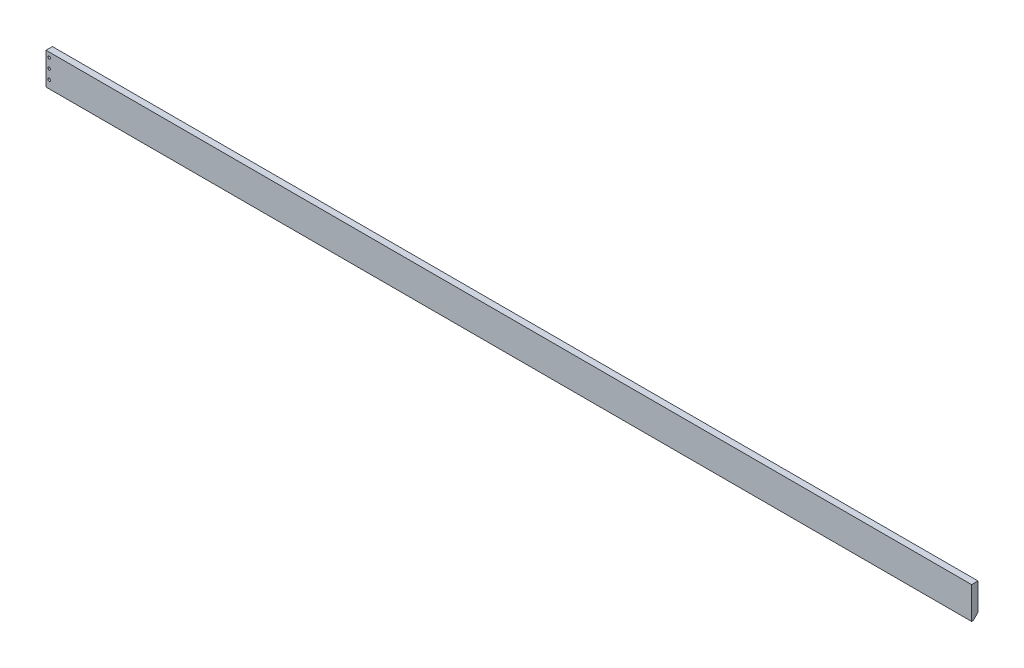
ISO-10303-21;
HEADER;
FILE_DESCRIPTION(('STEP AP214'),'2;1');
FILE_NAME('part.step','',(''),(''),'','','');
FILE_SCHEMA(('AUTOMOTIVE_DESIGN { 1 0 10303 214 1 1 1 1 }'));
ENDSEC;
DATA;
#1=APPLICATION_CONTEXT('core data for automotive mechanical design processes');
#2=APPLICATION_PROTOCOL_DEFINITION('international standard','automotive_design',2000,#1);
#3=PRODUCT_CONTEXT('',#1,'mechanical');
#4=PRODUCT('Part','Part','',(#3));
#5=PRODUCT_RELATED_PRODUCT_CATEGORY('part','',(#4));
#6=PRODUCT_DEFINITION_FORMATION('','',#4);
#7=PRODUCT_DEFINITION_CONTEXT('part definition',#1,'design');
#8=PRODUCT_DEFINITION('design','',#6,#7);
#9=PRODUCT_DEFINITION_SHAPE('','',#8);
#10=(LENGTH_UNIT() NAMED_UNIT(*) SI_UNIT(.MILLI.,.METRE.));
#11=(NAMED_UNIT(*) PLANE_ANGLE_UNIT() SI_UNIT($,.RADIAN.));
#12=(NAMED_UNIT(*) SI_UNIT($,.STERADIAN.) SOLID_ANGLE_UNIT());
#13=UNCERTAINTY_MEASURE_WITH_UNIT(LENGTH_MEASURE(1.E-05),#10,'distance_accuracy_value','');
#14=(GEOMETRIC_REPRESENTATION_CONTEXT(3) GLOBAL_UNCERTAINTY_ASSIGNED_CONTEXT((#13)) GLOBAL_UNIT_ASSIGNED_CONTEXT((#10,
#11,#12)) REPRESENTATION_CONTEXT('',''));
#15=CARTESIAN_POINT('',(0.,0.,0.));
#16=DIRECTION('',(0.,0.,1.));
#17=DIRECTION('',(1.,0.,0.));
#18=AXIS2_PLACEMENT_3D('',#15,#16,#17);
#19=CARTESIAN_POINT('',(1450.,50.,-20.));
#20=DIRECTION('',(-1.,0.,0.));
#21=DIRECTION('',(0.,0.,-1.));
#22=AXIS2_PLACEMENT_3D('',#19,#20,#21);
#23=PLANE('',#22);
#24=DIRECTION('',(0.,1.,0.));
#25=VECTOR('',#24,1.);
#26=CARTESIAN_POINT('',(1450.,50.,-20.));
#27=LINE('',#26,#25);
#28=CARTESIAN_POINT('',(1450.,-34.9999999999999,-20.));
#29=VERTEX_POINT('',#28);
#30=CARTESIAN_POINT('',(1450.,50.,-20.));
#31=VERTEX_POINT('',#30);
#32=EDGE_CURVE('E88',#29,#31,#27,.T.);
#33=ORIENTED_EDGE('',*,*,#32,.T.);
#34=DIRECTION('',(0.,0.,1.));
#35=VECTOR('',#34,1.);
#36=CARTESIAN_POINT('',(1450.,50.,-20.));
#37=LINE('',#36,#35);
#38=CARTESIAN_POINT('',(1450.,50.,0.));
#39=VERTEX_POINT('',#38);
#40=EDGE_CURVE('E96',#31,#39,#37,.T.);
#41=ORIENTED_EDGE('',*,*,#40,.T.);
#42=DIRECTION('',(0.,1.,0.));
#43=VECTOR('',#42,1.);
#44=CARTESIAN_POINT('',(1450.,50.,0.));
#45=LINE('',#44,#43);
#46=CARTESIAN_POINT('',(1450.,-50.,0.));
#47=VERTEX_POINT('',#46);
#48=EDGE_CURVE('E116',#47,#39,#45,.T.);
#49=ORIENTED_EDGE('',*,*,#48,.F.);
#50=DIRECTION('',(0.,0.,1.));
#51=VECTOR('',#50,1.);
#52=CARTESIAN_POINT('',(1450.,-50.,-20.));
#53=LINE('',#52,#51);
#54=CARTESIAN_POINT('',(1450.,-50.,-4.99999999999988));
#55=VERTEX_POINT('',#54);
#56=EDGE_CURVE('E115',#55,#47,#53,.T.);
#57=ORIENTED_EDGE('',*,*,#56,.F.);
#58=DIRECTION('',(0.,-0.707106781186548,0.707106781186548));
#59=VECTOR('',#58,1.);
#60=CARTESIAN_POINT('',(1450.,-34.9999999999999,-20.));
#61=LINE('',#60,#59);
#62=EDGE_CURVE('E108',#29,#55,#61,.T.);
#63=ORIENTED_EDGE('',*,*,#62,.F.);
#64=EDGE_LOOP('',(#33,#41,#49,#57,#63));
#65=FACE_BOUND('',#64,.T.);
#66=ADVANCED_FACE('F37',(#65),#23,.F.);
#67=CARTESIAN_POINT('',(-1450.,50.,-20.));
#68=DIRECTION('',(0.,-1.,0.));
#69=DIRECTION('',(0.,0.,1.));
#70=AXIS2_PLACEMENT_3D('',#67,#68,#69);
#71=PLANE('',#70);
#72=DIRECTION('',(-1.,0.,0.));
#73=VECTOR('',#72,1.);
#74=CARTESIAN_POINT('',(-1450.,50.,0.));
#75=LINE('',#74,#73);
#76=CARTESIAN_POINT('',(-1450.,50.,0.));
#77=VERTEX_POINT('',#76);
#78=EDGE_CURVE('E99',#39,#77,#75,.T.);
#79=ORIENTED_EDGE('',*,*,#78,.F.);
#80=ORIENTED_EDGE('',*,*,#40,.F.);
#81=DIRECTION('',(-1.,0.,0.));
#82=VECTOR('',#81,1.);
#83=CARTESIAN_POINT('',(-1450.,50.,-20.));
#84=LINE('',#83,#82);
#85=CARTESIAN_POINT('',(-1450.,50.,-20.));
#86=VERTEX_POINT('',#85);
#87=EDGE_CURVE('E84',#31,#86,#84,.T.);
#88=ORIENTED_EDGE('',*,*,#87,.T.);
#89=DIRECTION('',(0.,0.,1.));
#90=VECTOR('',#89,1.);
#91=CARTESIAN_POINT('',(-1450.,50.,-20.));
#92=LINE('',#91,#90);
#93=EDGE_CURVE('E104',#86,#77,#92,.T.);
#94=ORIENTED_EDGE('',*,*,#93,.T.);
#95=EDGE_LOOP('',(#79,#80,#88,#94));
#96=FACE_BOUND('',#95,.T.);
#97=ADVANCED_FACE('F97',(#96),#71,.F.);
#98=CARTESIAN_POINT('',(-1450.,50.,-20.));
#99=DIRECTION('',(1.,0.,0.));
#100=DIRECTION('',(0.,0.,1.));
#101=AXIS2_PLACEMENT_3D('',#98,#99,#100);
#102=PLANE('',#101);
#103=DIRECTION('',(0.,0.,1.));
#104=VECTOR('',#103,1.);
#105=CARTESIAN_POINT('',(-1450.,-50.,-20.));
#106=LINE('',#105,#104);
#107=CARTESIAN_POINT('',(-1450.,-50.,-4.99999999999988));
#108=VERTEX_POINT('',#107);
#109=CARTESIAN_POINT('',(-1450.,-50.,0.));
#110=VERTEX_POINT('',#109);
#111=EDGE_CURVE('E123',#108,#110,#106,.T.);
#112=ORIENTED_EDGE('',*,*,#111,.T.);
#113=DIRECTION('',(0.,-1.,0.));
#114=VECTOR('',#113,1.);
#115=CARTESIAN_POINT('',(-1450.,50.,0.));
#116=LINE('',#115,#114);
#117=EDGE_CURVE('E111',#77,#110,#116,.T.);
#118=ORIENTED_EDGE('',*,*,#117,.F.);
#119=ORIENTED_EDGE('',*,*,#93,.F.);
#120=DIRECTION('',(0.,-1.,0.));
#121=VECTOR('',#120,1.);
#122=CARTESIAN_POINT('',(-1450.,50.,-20.));
#123=LINE('',#122,#121);
#124=CARTESIAN_POINT('',(-1450.,-34.9999999999999,-20.));
#125=VERTEX_POINT('',#124);
#126=EDGE_CURVE('E90',#86,#125,#123,.T.);
#127=ORIENTED_EDGE('',*,*,#126,.T.);
#128=DIRECTION('',(0.,0.707106781186548,-0.707106781186548));
#129=VECTOR('',#128,1.);
#130=CARTESIAN_POINT('',(-1450.,-34.9999999999999,-20.));
#131=LINE('',#130,#129);
#132=EDGE_CURVE('E130',#108,#125,#131,.T.);
#133=ORIENTED_EDGE('',*,*,#132,.F.);
#134=EDGE_LOOP('',(#112,#118,#119,#127,#133));
#135=FACE_BOUND('',#134,.T.);
#136=ADVANCED_FACE('F171',(#135),#102,.F.);
#137=CARTESIAN_POINT('',(-1450.,-50.,-20.));
#138=DIRECTION('',(0.,1.,0.));
#139=DIRECTION('',(0.,0.,-1.));
#140=AXIS2_PLACEMENT_3D('',#137,#138,#139);
#141=PLANE('',#140);
#142=ORIENTED_EDGE('',*,*,#56,.T.);
#143=DIRECTION('',(1.,0.,0.));
#144=VECTOR('',#143,1.);
#145=CARTESIAN_POINT('',(-1450.,-50.,0.));
#146=LINE('',#145,#144);
#147=EDGE_CURVE('E109',#110,#47,#146,.T.);
#148=ORIENTED_EDGE('',*,*,#147,.F.);
#149=ORIENTED_EDGE('',*,*,#111,.F.);
#150=DIRECTION('',(-1.,0.,0.));
#151=VECTOR('',#150,1.);
#152=CARTESIAN_POINT('',(-1450.,-50.,-4.99999999999988));
#153=LINE('',#152,#151);
#154=EDGE_CURVE('E52',#55,#108,#153,.T.);
#155=ORIENTED_EDGE('',*,*,#154,.F.);
#156=EDGE_LOOP('',(#142,#148,#149,#155));
#157=FACE_BOUND('',#156,.T.);
#158=ADVANCED_FACE('F169',(#157),#141,.F.);
#159=CARTESIAN_POINT('',(0.,0.,-20.));
#160=DIRECTION('',(0.,0.,-1.));
#161=DIRECTION('',(1.,0.,0.));
#162=AXIS2_PLACEMENT_3D('',#159,#160,#161);
#163=PLANE('',#162);
#164=CARTESIAN_POINT('',(-1440.,-25.,-20.));
#165=DIRECTION('',(0.,0.,1.));
#166=DIRECTION('',(1.,0.,0.));
#167=AXIS2_PLACEMENT_3D('',#164,#165,#166);
#168=CIRCLE('',#167,7.25000000000042);
#169=CARTESIAN_POINT('',(-1432.75,-25.,-20.));
#170=VERTEX_POINT('',#169);
#171=EDGE_CURVE('E149',#170,#170,#168,.F.);
#172=ORIENTED_EDGE('',*,*,#171,.F.);
#173=EDGE_LOOP('',(#172));
#174=FACE_BOUND('',#173,.T.);
#175=CARTESIAN_POINT('',(-1440.,5.,-20.));
#176=DIRECTION('',(0.,0.,1.));
#177=DIRECTION('',(1.,0.,0.));
#178=AXIS2_PLACEMENT_3D('',#175,#176,#177);
#179=CIRCLE('',#178,7.25000000000042);
#180=CARTESIAN_POINT('',(-1432.75,5.,-20.));
#181=VERTEX_POINT('',#180);
#182=EDGE_CURVE('E146',#181,#181,#179,.F.);
#183=ORIENTED_EDGE('',*,*,#182,.F.);
#184=EDGE_LOOP('',(#183));
#185=FACE_BOUND('',#184,.T.);
#186=CARTESIAN_POINT('',(-1440.,35.,-20.));
#187=DIRECTION('',(0.,0.,1.));
#188=DIRECTION('',(1.,0.,0.));
#189=AXIS2_PLACEMENT_3D('',#186,#187,#188);
#190=CIRCLE('',#189,7.25000000000042);
#191=CARTESIAN_POINT('',(-1432.75,35.,-20.));
#192=VERTEX_POINT('',#191);
#193=EDGE_CURVE('E143',#192,#192,#190,.F.);
#194=ORIENTED_EDGE('',*,*,#193,.F.);
#195=EDGE_LOOP('',(#194));
#196=FACE_BOUND('',#195,.T.);
#197=ORIENTED_EDGE('',*,*,#126,.F.);
#198=ORIENTED_EDGE('',*,*,#87,.F.);
#199=ORIENTED_EDGE('',*,*,#32,.F.);
#200=DIRECTION('',(1.,0.,0.));
#201=VECTOR('',#200,1.);
#202=CARTESIAN_POINT('',(1450.,-34.9999999999999,-20.));
#203=LINE('',#202,#201);
#204=EDGE_CURVE('E103',#125,#29,#203,.T.);
#205=ORIENTED_EDGE('',*,*,#204,.F.);
#206=EDGE_LOOP('',(#197,#198,#199,#205));
#207=FACE_BOUND('',#206,.T.);
#208=ADVANCED_FACE('F86',(#174,#185,#196,#207),#163,.T.);
#209=CARTESIAN_POINT('',(0.,0.,0.));
#210=DIRECTION('',(0.,0.,-1.));
#211=DIRECTION('',(1.,0.,0.));
#212=AXIS2_PLACEMENT_3D('',#209,#210,#211);
#213=PLANE('',#212);
#214=CARTESIAN_POINT('',(-1440.,35.,0.));
#215=DIRECTION('',(0.,0.,1.));
#216=DIRECTION('',(1.,0.,0.));
#217=AXIS2_PLACEMENT_3D('',#214,#215,#216);
#218=CIRCLE('',#217,4.25000000000001);
#219=CARTESIAN_POINT('',(-1435.75,35.,0.));
#220=VERTEX_POINT('',#219);
#221=EDGE_CURVE('E118',#220,#220,#218,.T.);
#222=ORIENTED_EDGE('',*,*,#221,.F.);
#223=EDGE_LOOP('',(#222));
#224=FACE_BOUND('',#223,.T.);
#225=CARTESIAN_POINT('',(-1440.,-25.,0.));
#226=DIRECTION('',(0.,0.,1.));
#227=DIRECTION('',(1.,0.,0.));
#228=AXIS2_PLACEMENT_3D('',#225,#226,#227);
#229=CIRCLE('',#228,4.25000000000001);
#230=CARTESIAN_POINT('',(-1435.75,-25.,0.));
#231=VERTEX_POINT('',#230);
#232=EDGE_CURVE('E136',#231,#231,#229,.T.);
#233=ORIENTED_EDGE('',*,*,#232,.F.);
#234=EDGE_LOOP('',(#233));
#235=FACE_BOUND('',#234,.T.);
#236=CARTESIAN_POINT('',(-1440.,5.,0.));
#237=DIRECTION('',(0.,0.,1.));
#238=DIRECTION('',(1.,0.,0.));
#239=AXIS2_PLACEMENT_3D('',#236,#237,#238);
#240=CIRCLE('',#239,4.25000000000001);
#241=CARTESIAN_POINT('',(-1435.75,5.,0.));
#242=VERTEX_POINT('',#241);
#243=EDGE_CURVE('E133',#242,#242,#240,.T.);
#244=ORIENTED_EDGE('',*,*,#243,.F.);
#245=EDGE_LOOP('',(#244));
#246=FACE_BOUND('',#245,.T.);
#247=ORIENTED_EDGE('',*,*,#48,.T.);
#248=ORIENTED_EDGE('',*,*,#78,.T.);
#249=ORIENTED_EDGE('',*,*,#117,.T.);
#250=ORIENTED_EDGE('',*,*,#147,.T.);
#251=EDGE_LOOP('',(#247,#248,#249,#250));
#252=FACE_BOUND('',#251,.T.);
#253=ADVANCED_FACE('F164',(#224,#235,#246,#252),#213,.F.);
#254=CARTESIAN_POINT('',(0.,-34.9999999999999,-20.));
#255=DIRECTION('',(0.,-0.707106781186548,-0.707106781186548));
#256=DIRECTION('',(-1.,0.,0.));
#257=AXIS2_PLACEMENT_3D('',#254,#255,#256);
#258=PLANE('',#257);
#259=ORIENTED_EDGE('',*,*,#132,.T.);
#260=ORIENTED_EDGE('',*,*,#204,.T.);
#261=ORIENTED_EDGE('',*,*,#62,.T.);
#262=ORIENTED_EDGE('',*,*,#154,.T.);
#263=EDGE_LOOP('',(#259,#260,#261,#262));
#264=FACE_BOUND('',#263,.T.);
#265=ADVANCED_FACE('F160',(#264),#258,.T.);
#266=CARTESIAN_POINT('',(-1440.,5.,10.));
#267=DIRECTION('',(0.,0.,-1.));
#268=DIRECTION('',(1.,0.,0.));
#269=AXIS2_PLACEMENT_3D('',#266,#267,#268);
#270=CYLINDRICAL_SURFACE('',#269,4.25000000000001);
#271=CARTESIAN_POINT('',(-1440.,5.,-16.9999999999996));
#272=DIRECTION('',(0.,0.,1.));
#273=DIRECTION('',(1.,0.,0.));
#274=AXIS2_PLACEMENT_3D('',#271,#272,#273);
#275=CIRCLE('',#274,4.25000000000001);
#276=CARTESIAN_POINT('',(-1435.75,5.,-16.9999999999996));
#277=VERTEX_POINT('',#276);
#278=EDGE_CURVE('E45',#277,#277,#275,.T.);
#279=ORIENTED_EDGE('',*,*,#278,.F.);
#280=EDGE_LOOP('',(#279));
#281=FACE_BOUND('',#280,.T.);
#282=ORIENTED_EDGE('',*,*,#243,.T.);
#283=EDGE_LOOP('',(#282));
#284=FACE_BOUND('',#283,.T.);
#285=ADVANCED_FACE('F156',(#281,#284),#270,.F.);
#286=CARTESIAN_POINT('',(-1440.,-25.,10.));
#287=DIRECTION('',(0.,0.,-1.));
#288=DIRECTION('',(1.,0.,0.));
#289=AXIS2_PLACEMENT_3D('',#286,#287,#288);
#290=CYLINDRICAL_SURFACE('',#289,4.25000000000001);
#291=CARTESIAN_POINT('',(-1440.,-25.,-16.9999999999996));
#292=DIRECTION('',(0.,0.,1.));
#293=DIRECTION('',(1.,0.,0.));
#294=AXIS2_PLACEMENT_3D('',#291,#292,#293);
#295=CIRCLE('',#294,4.25000000000001);
#296=CARTESIAN_POINT('',(-1435.75,-25.,-16.9999999999996));
#297=VERTEX_POINT('',#296);
#298=EDGE_CURVE('E132',#297,#297,#295,.T.);
#299=ORIENTED_EDGE('',*,*,#298,.F.);
#300=EDGE_LOOP('',(#299));
#301=FACE_BOUND('',#300,.T.);
#302=ORIENTED_EDGE('',*,*,#232,.T.);
#303=EDGE_LOOP('',(#302));
#304=FACE_BOUND('',#303,.T.);
#305=ADVANCED_FACE('F159',(#301,#304),#290,.F.);
#306=CARTESIAN_POINT('',(-1440.,35.,10.));
#307=DIRECTION('',(0.,0.,-1.));
#308=DIRECTION('',(1.,0.,0.));
#309=AXIS2_PLACEMENT_3D('',#306,#307,#308);
#310=CYLINDRICAL_SURFACE('',#309,4.25000000000001);
#311=CARTESIAN_POINT('',(-1440.,35.,-16.9999999999996));
#312=DIRECTION('',(0.,0.,1.));
#313=DIRECTION('',(1.,0.,0.));
#314=AXIS2_PLACEMENT_3D('',#311,#312,#313);
#315=CIRCLE('',#314,4.25000000000001);
#316=CARTESIAN_POINT('',(-1435.75,35.,-16.9999999999996));
#317=VERTEX_POINT('',#316);
#318=EDGE_CURVE('E11',#317,#317,#315,.T.);
#319=ORIENTED_EDGE('',*,*,#318,.F.);
#320=EDGE_LOOP('',(#319));
#321=FACE_BOUND('',#320,.T.);
#322=ORIENTED_EDGE('',*,*,#221,.T.);
#323=EDGE_LOOP('',(#322));
#324=FACE_BOUND('',#323,.T.);
#325=ADVANCED_FACE('F193',(#321,#324),#310,.F.);
#326=CARTESIAN_POINT('',(-1440.,-25.,-16.9999999999996));
#327=DIRECTION('',(0.,0.,-1.));
#328=DIRECTION('',(1.,0.,0.));
#329=AXIS2_PLACEMENT_3D('',#326,#327,#328);
#330=CONICAL_SURFACE('',#329,4.25000000000001,0.785398163397446);
#331=ORIENTED_EDGE('',*,*,#171,.T.);
#332=EDGE_LOOP('',(#331));
#333=FACE_BOUND('',#332,.T.);
#334=ORIENTED_EDGE('',*,*,#298,.T.);
#335=EDGE_LOOP('',(#334));
#336=FACE_BOUND('',#335,.T.);
#337=ADVANCED_FACE('F196',(#333,#336),#330,.F.);
#338=CARTESIAN_POINT('',(-1440.,5.,-16.9999999999996));
#339=DIRECTION('',(0.,0.,-1.));
#340=DIRECTION('',(1.,0.,0.));
#341=AXIS2_PLACEMENT_3D('',#338,#339,#340);
#342=CONICAL_SURFACE('',#341,4.25000000000001,0.785398163397446);
#343=ORIENTED_EDGE('',*,*,#182,.T.);
#344=EDGE_LOOP('',(#343));
#345=FACE_BOUND('',#344,.T.);
#346=ORIENTED_EDGE('',*,*,#278,.T.);
#347=EDGE_LOOP('',(#346));
#348=FACE_BOUND('',#347,.T.);
#349=ADVANCED_FACE('F154',(#345,#348),#342,.F.);
#350=CARTESIAN_POINT('',(-1440.,35.,-16.9999999999996));
#351=DIRECTION('',(0.,0.,-1.));
#352=DIRECTION('',(1.,0.,0.));
#353=AXIS2_PLACEMENT_3D('',#350,#351,#352);
#354=CONICAL_SURFACE('',#353,4.25000000000001,0.785398163397446);
#355=ORIENTED_EDGE('',*,*,#193,.T.);
#356=EDGE_LOOP('',(#355));
#357=FACE_BOUND('',#356,.T.);
#358=ORIENTED_EDGE('',*,*,#318,.T.);
#359=EDGE_LOOP('',(#358));
#360=FACE_BOUND('',#359,.T.);
#361=ADVANCED_FACE('F39',(#357,#360),#354,.F.);
#362=CLOSED_SHELL('',(#66,#97,#136,#158,#208,#253,#265,#285,#305,#325,#337,#349,#361));
#363=MANIFOLD_SOLID_BREP('B2',#362);
#364=ADVANCED_BREP_SHAPE_REPRESENTATION('',(#18,#363),#14);
#365=SHAPE_DEFINITION_REPRESENTATION(#9,#364);
ENDSEC;
END-ISO-10303-21;
